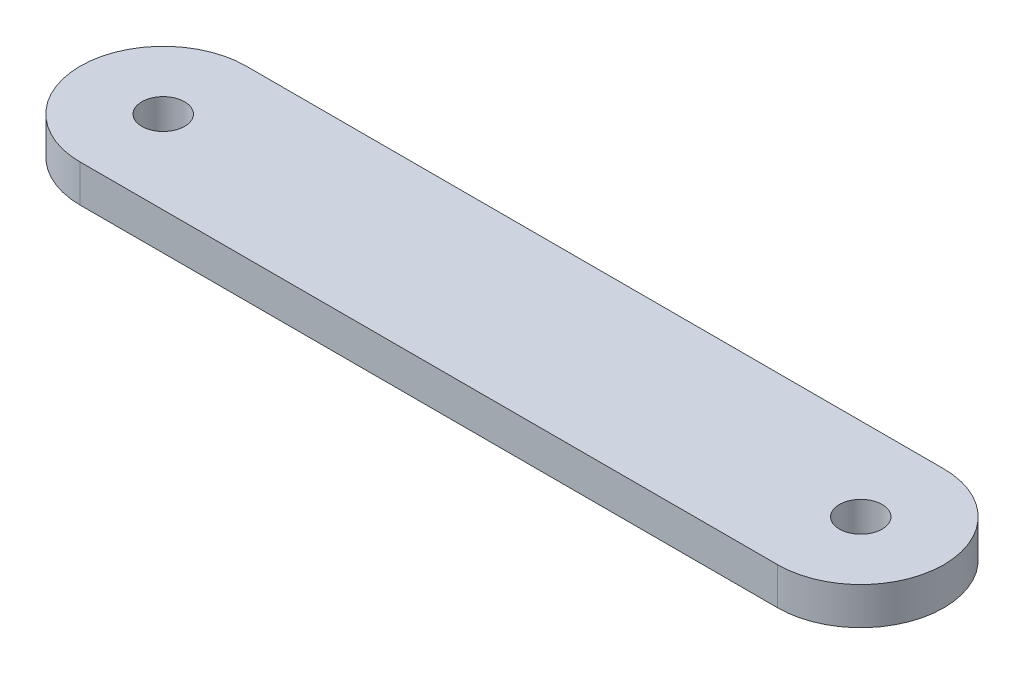
ISO-10303-21;
HEADER;
FILE_DESCRIPTION(('STEP AP214'),'2;1');
FILE_NAME('part.step','',(''),(''),'','','');
FILE_SCHEMA(('AUTOMOTIVE_DESIGN { 1 0 10303 214 1 1 1 1 }'));
ENDSEC;
DATA;
#1=APPLICATION_CONTEXT('core data for automotive mechanical design processes');
#2=APPLICATION_PROTOCOL_DEFINITION('international standard','automotive_design',2000,#1);
#3=PRODUCT_CONTEXT('',#1,'mechanical');
#4=PRODUCT('Part','Part','',(#3));
#5=PRODUCT_RELATED_PRODUCT_CATEGORY('part','',(#4));
#6=PRODUCT_DEFINITION_FORMATION('','',#4);
#7=PRODUCT_DEFINITION_CONTEXT('part definition',#1,'design');
#8=PRODUCT_DEFINITION('design','',#6,#7);
#9=PRODUCT_DEFINITION_SHAPE('','',#8);
#10=(LENGTH_UNIT() NAMED_UNIT(*) SI_UNIT(.MILLI.,.METRE.));
#11=(NAMED_UNIT(*) PLANE_ANGLE_UNIT() SI_UNIT($,.RADIAN.));
#12=(NAMED_UNIT(*) SI_UNIT($,.STERADIAN.) SOLID_ANGLE_UNIT());
#13=UNCERTAINTY_MEASURE_WITH_UNIT(LENGTH_MEASURE(1.E-05),#10,'distance_accuracy_value','');
#14=(GEOMETRIC_REPRESENTATION_CONTEXT(3) GLOBAL_UNCERTAINTY_ASSIGNED_CONTEXT((#13)) GLOBAL_UNIT_ASSIGNED_CONTEXT((#10,
#11,#12)) REPRESENTATION_CONTEXT('',''));
#15=CARTESIAN_POINT('',(0.,0.,0.));
#16=DIRECTION('',(0.,0.,1.));
#17=DIRECTION('',(1.,0.,0.));
#18=AXIS2_PLACEMENT_3D('',#15,#16,#17);
#19=CARTESIAN_POINT('',(42.,4.5,0.));
#20=DIRECTION('',(0.,-1.,0.));
#21=DIRECTION('',(0.,0.,-1.));
#22=AXIS2_PLACEMENT_3D('',#19,#20,#21);
#23=CYLINDRICAL_SURFACE('',#22,10.);
#24=CARTESIAN_POINT('',(42.,0.,0.));
#25=DIRECTION('',(0.,1.,0.));
#26=DIRECTION('',(0.,0.,-1.));
#27=AXIS2_PLACEMENT_3D('',#24,#25,#26);
#28=CIRCLE('',#27,10.);
#29=CARTESIAN_POINT('',(42.,0.,10.));
#30=VERTEX_POINT('',#29);
#31=CARTESIAN_POINT('',(42.,0.,-10.));
#32=VERTEX_POINT('',#31);
#33=EDGE_CURVE('E113',#30,#32,#28,.T.);
#34=ORIENTED_EDGE('',*,*,#33,.T.);
#35=DIRECTION('',(0.,-1.,0.));
#36=VECTOR('',#35,1.);
#37=CARTESIAN_POINT('',(42.,4.5,-10.));
#38=LINE('',#37,#36);
#39=CARTESIAN_POINT('',(42.,4.5,-10.));
#40=VERTEX_POINT('',#39);
#41=EDGE_CURVE('E11',#40,#32,#38,.T.);
#42=ORIENTED_EDGE('',*,*,#41,.F.);
#43=CARTESIAN_POINT('',(42.,4.5,0.));
#44=DIRECTION('',(0.,1.,0.));
#45=DIRECTION('',(0.,0.,-1.));
#46=AXIS2_PLACEMENT_3D('',#43,#44,#45);
#47=CIRCLE('',#46,10.);
#48=CARTESIAN_POINT('',(42.,4.5,10.));
#49=VERTEX_POINT('',#48);
#50=EDGE_CURVE('E97',#49,#40,#47,.T.);
#51=ORIENTED_EDGE('',*,*,#50,.F.);
#52=DIRECTION('',(0.,-1.,0.));
#53=VECTOR('',#52,1.);
#54=CARTESIAN_POINT('',(42.,4.5,10.));
#55=LINE('',#54,#53);
#56=EDGE_CURVE('E109',#49,#30,#55,.T.);
#57=ORIENTED_EDGE('',*,*,#56,.T.);
#58=EDGE_LOOP('',(#34,#42,#51,#57));
#59=FACE_BOUND('',#58,.T.);
#60=ADVANCED_FACE('F45',(#59),#23,.T.);
#61=CARTESIAN_POINT('',(42.,4.5,-10.));
#62=DIRECTION('',(0.,0.,1.));
#63=DIRECTION('',(1.,0.,0.));
#64=AXIS2_PLACEMENT_3D('',#61,#62,#63);
#65=PLANE('',#64);
#66=DIRECTION('',(-1.,0.,0.));
#67=VECTOR('',#66,1.);
#68=CARTESIAN_POINT('',(42.,0.,-10.));
#69=LINE('',#68,#67);
#70=CARTESIAN_POINT('',(-42.,0.,-9.99999999999999));
#71=VERTEX_POINT('',#70);
#72=EDGE_CURVE('E102',#32,#71,#69,.T.);
#73=ORIENTED_EDGE('',*,*,#72,.T.);
#74=DIRECTION('',(0.,-1.,0.));
#75=VECTOR('',#74,1.);
#76=CARTESIAN_POINT('',(-42.,4.5,-9.99999999999999));
#77=LINE('',#76,#75);
#78=CARTESIAN_POINT('',(-42.,4.5,-9.99999999999999));
#79=VERTEX_POINT('',#78);
#80=EDGE_CURVE('E54',#79,#71,#77,.T.);
#81=ORIENTED_EDGE('',*,*,#80,.F.);
#82=DIRECTION('',(-1.,0.,0.));
#83=VECTOR('',#82,1.);
#84=CARTESIAN_POINT('',(42.,4.5,-10.));
#85=LINE('',#84,#83);
#86=EDGE_CURVE('E92',#40,#79,#85,.T.);
#87=ORIENTED_EDGE('',*,*,#86,.F.);
#88=ORIENTED_EDGE('',*,*,#41,.T.);
#89=EDGE_LOOP('',(#73,#81,#87,#88));
#90=FACE_BOUND('',#89,.T.);
#91=ADVANCED_FACE('F101',(#90),#65,.F.);
#92=CARTESIAN_POINT('',(-42.,4.5,0.));
#93=DIRECTION('',(0.,-1.,0.));
#94=DIRECTION('',(0.,0.,-1.));
#95=AXIS2_PLACEMENT_3D('',#92,#93,#94);
#96=CYLINDRICAL_SURFACE('',#95,10.);
#97=CARTESIAN_POINT('',(-42.,0.,0.));
#98=DIRECTION('',(0.,1.,0.));
#99=DIRECTION('',(0.,0.,1.));
#100=AXIS2_PLACEMENT_3D('',#97,#98,#99);
#101=CIRCLE('',#100,10.);
#102=CARTESIAN_POINT('',(-42.,0.,10.));
#103=VERTEX_POINT('',#102);
#104=EDGE_CURVE('E79',#71,#103,#101,.T.);
#105=ORIENTED_EDGE('',*,*,#104,.T.);
#106=DIRECTION('',(0.,-1.,0.));
#107=VECTOR('',#106,1.);
#108=CARTESIAN_POINT('',(-42.,4.5,10.));
#109=LINE('',#108,#107);
#110=CARTESIAN_POINT('',(-42.,4.5,10.));
#111=VERTEX_POINT('',#110);
#112=EDGE_CURVE('E104',#111,#103,#109,.T.);
#113=ORIENTED_EDGE('',*,*,#112,.F.);
#114=CARTESIAN_POINT('',(-42.,4.5,0.));
#115=DIRECTION('',(0.,1.,0.));
#116=DIRECTION('',(0.,0.,1.));
#117=AXIS2_PLACEMENT_3D('',#114,#115,#116);
#118=CIRCLE('',#117,10.);
#119=EDGE_CURVE('E95',#79,#111,#118,.T.);
#120=ORIENTED_EDGE('',*,*,#119,.F.);
#121=ORIENTED_EDGE('',*,*,#80,.T.);
#122=EDGE_LOOP('',(#105,#113,#120,#121));
#123=FACE_BOUND('',#122,.T.);
#124=ADVANCED_FACE('F105',(#123),#96,.T.);
#125=CARTESIAN_POINT('',(42.,4.5,10.));
#126=DIRECTION('',(0.,0.,-1.));
#127=DIRECTION('',(-1.,0.,0.));
#128=AXIS2_PLACEMENT_3D('',#125,#126,#127);
#129=PLANE('',#128);
#130=DIRECTION('',(1.,0.,0.));
#131=VECTOR('',#130,1.);
#132=CARTESIAN_POINT('',(42.,0.,10.));
#133=LINE('',#132,#131);
#134=EDGE_CURVE('E85',#103,#30,#133,.T.);
#135=ORIENTED_EDGE('',*,*,#134,.T.);
#136=ORIENTED_EDGE('',*,*,#56,.F.);
#137=DIRECTION('',(1.,0.,0.));
#138=VECTOR('',#137,1.);
#139=CARTESIAN_POINT('',(42.,4.5,10.));
#140=LINE('',#139,#138);
#141=EDGE_CURVE('E62',#111,#49,#140,.T.);
#142=ORIENTED_EDGE('',*,*,#141,.F.);
#143=ORIENTED_EDGE('',*,*,#112,.T.);
#144=EDGE_LOOP('',(#135,#136,#142,#143));
#145=FACE_BOUND('',#144,.T.);
#146=ADVANCED_FACE('F127',(#145),#129,.F.);
#147=CARTESIAN_POINT('',(42.,4.5,0.));
#148=DIRECTION('',(0.,-1.,0.));
#149=DIRECTION('',(0.,0.,-1.));
#150=AXIS2_PLACEMENT_3D('',#147,#148,#149);
#151=PLANE('',#150);
#152=CARTESIAN_POINT('',(42.,4.5,0.));
#153=DIRECTION('',(0.,1.,0.));
#154=DIRECTION('',(0.,0.,1.));
#155=AXIS2_PLACEMENT_3D('',#152,#153,#154);
#156=CIRCLE('',#155,2.575);
#157=CARTESIAN_POINT('',(42.,4.5,2.57499999999998));
#158=VERTEX_POINT('',#157);
#159=EDGE_CURVE('E142',#158,#158,#156,.T.);
#160=ORIENTED_EDGE('',*,*,#159,.F.);
#161=EDGE_LOOP('',(#160));
#162=FACE_BOUND('',#161,.T.);
#163=CARTESIAN_POINT('',(-42.,4.5,0.));
#164=DIRECTION('',(0.,1.,0.));
#165=DIRECTION('',(0.,0.,1.));
#166=AXIS2_PLACEMENT_3D('',#163,#164,#165);
#167=CIRCLE('',#166,2.575);
#168=CARTESIAN_POINT('',(-42.,4.5,2.57500000000001));
#169=VERTEX_POINT('',#168);
#170=EDGE_CURVE('E138',#169,#169,#167,.T.);
#171=ORIENTED_EDGE('',*,*,#170,.F.);
#172=EDGE_LOOP('',(#171));
#173=FACE_BOUND('',#172,.T.);
#174=ORIENTED_EDGE('',*,*,#50,.T.);
#175=ORIENTED_EDGE('',*,*,#86,.T.);
#176=ORIENTED_EDGE('',*,*,#119,.T.);
#177=ORIENTED_EDGE('',*,*,#141,.T.);
#178=EDGE_LOOP('',(#174,#175,#176,#177));
#179=FACE_BOUND('',#178,.T.);
#180=ADVANCED_FACE('F93',(#162,#173,#179),#151,.F.);
#181=CARTESIAN_POINT('',(42.,0.,0.));
#182=DIRECTION('',(0.,-1.,0.));
#183=DIRECTION('',(0.,0.,-1.));
#184=AXIS2_PLACEMENT_3D('',#181,#182,#183);
#185=PLANE('',#184);
#186=CARTESIAN_POINT('',(42.,0.,0.));
#187=DIRECTION('',(0.,1.,0.));
#188=DIRECTION('',(0.,0.,1.));
#189=AXIS2_PLACEMENT_3D('',#186,#187,#188);
#190=CIRCLE('',#189,2.575);
#191=CARTESIAN_POINT('',(42.,0.,2.57499999999998));
#192=VERTEX_POINT('',#191);
#193=EDGE_CURVE('E117',#192,#192,#190,.T.);
#194=ORIENTED_EDGE('',*,*,#193,.T.);
#195=EDGE_LOOP('',(#194));
#196=FACE_BOUND('',#195,.T.);
#197=CARTESIAN_POINT('',(-42.,0.,0.));
#198=DIRECTION('',(0.,1.,0.));
#199=DIRECTION('',(0.,0.,1.));
#200=AXIS2_PLACEMENT_3D('',#197,#198,#199);
#201=CIRCLE('',#200,2.575);
#202=CARTESIAN_POINT('',(-42.,0.,2.57500000000001));
#203=VERTEX_POINT('',#202);
#204=EDGE_CURVE('E134',#203,#203,#201,.T.);
#205=ORIENTED_EDGE('',*,*,#204,.T.);
#206=EDGE_LOOP('',(#205));
#207=FACE_BOUND('',#206,.T.);
#208=ORIENTED_EDGE('',*,*,#33,.F.);
#209=ORIENTED_EDGE('',*,*,#134,.F.);
#210=ORIENTED_EDGE('',*,*,#104,.F.);
#211=ORIENTED_EDGE('',*,*,#72,.F.);
#212=EDGE_LOOP('',(#208,#209,#210,#211));
#213=FACE_BOUND('',#212,.T.);
#214=ADVANCED_FACE('F130',(#196,#207,#213),#185,.T.);
#215=CARTESIAN_POINT('',(-42.,0.,0.));
#216=DIRECTION('',(0.,1.,0.));
#217=DIRECTION('',(0.,0.,1.));
#218=AXIS2_PLACEMENT_3D('',#215,#216,#217);
#219=CYLINDRICAL_SURFACE('',#218,2.575);
#220=ORIENTED_EDGE('',*,*,#204,.F.);
#221=EDGE_LOOP('',(#220));
#222=FACE_BOUND('',#221,.T.);
#223=ORIENTED_EDGE('',*,*,#170,.T.);
#224=EDGE_LOOP('',(#223));
#225=FACE_BOUND('',#224,.T.);
#226=ADVANCED_FACE('F155',(#222,#225),#219,.F.);
#227=CARTESIAN_POINT('',(42.,0.,0.));
#228=DIRECTION('',(0.,1.,0.));
#229=DIRECTION('',(0.,0.,1.));
#230=AXIS2_PLACEMENT_3D('',#227,#228,#229);
#231=CYLINDRICAL_SURFACE('',#230,2.575);
#232=ORIENTED_EDGE('',*,*,#193,.F.);
#233=EDGE_LOOP('',(#232));
#234=FACE_BOUND('',#233,.T.);
#235=ORIENTED_EDGE('',*,*,#159,.T.);
#236=EDGE_LOOP('',(#235));
#237=FACE_BOUND('',#236,.T.);
#238=ADVANCED_FACE('F152',(#234,#237),#231,.F.);
#239=CLOSED_SHELL('',(#60,#91,#124,#146,#180,#214,#226,#238));
#240=MANIFOLD_SOLID_BREP('B2',#239);
#241=ADVANCED_BREP_SHAPE_REPRESENTATION('',(#18,#240),#14);
#242=SHAPE_DEFINITION_REPRESENTATION(#9,#241);
ENDSEC;
END-ISO-10303-21;
